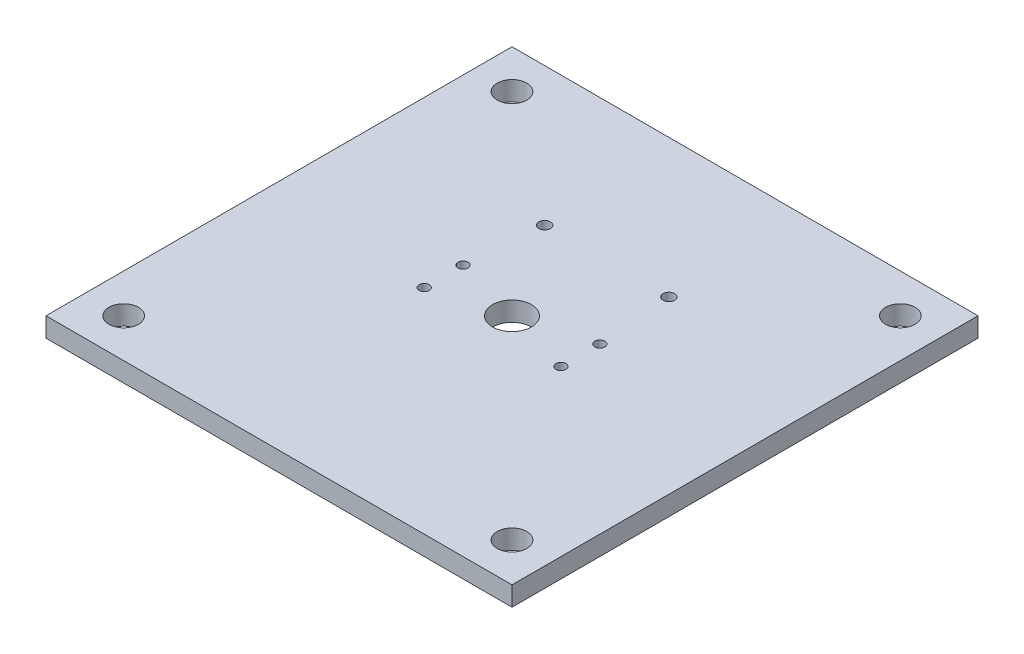
ISO-10303-21;
HEADER;
FILE_DESCRIPTION(('STEP AP214'),'2;1');
FILE_NAME('part.step','',(''),(''),'','','');
FILE_SCHEMA(('AUTOMOTIVE_DESIGN { 1 0 10303 214 1 1 1 1 }'));
ENDSEC;
DATA;
#1=APPLICATION_CONTEXT('core data for automotive mechanical design processes');
#2=APPLICATION_PROTOCOL_DEFINITION('international standard','automotive_design',2000,#1);
#3=PRODUCT_CONTEXT('',#1,'mechanical');
#4=PRODUCT('Part','Part','',(#3));
#5=PRODUCT_RELATED_PRODUCT_CATEGORY('part','',(#4));
#6=PRODUCT_DEFINITION_FORMATION('','',#4);
#7=PRODUCT_DEFINITION_CONTEXT('part definition',#1,'design');
#8=PRODUCT_DEFINITION('design','',#6,#7);
#9=PRODUCT_DEFINITION_SHAPE('','',#8);
#10=(LENGTH_UNIT() NAMED_UNIT(*) SI_UNIT(.MILLI.,.METRE.));
#11=(NAMED_UNIT(*) PLANE_ANGLE_UNIT() SI_UNIT($,.RADIAN.));
#12=(NAMED_UNIT(*) SI_UNIT($,.STERADIAN.) SOLID_ANGLE_UNIT());
#13=UNCERTAINTY_MEASURE_WITH_UNIT(LENGTH_MEASURE(1.E-05),#10,'distance_accuracy_value','');
#14=(GEOMETRIC_REPRESENTATION_CONTEXT(3) GLOBAL_UNCERTAINTY_ASSIGNED_CONTEXT((#13)) GLOBAL_UNIT_ASSIGNED_CONTEXT((#10,
#11,#12)) REPRESENTATION_CONTEXT('',''));
#15=CARTESIAN_POINT('',(0.,0.,0.));
#16=DIRECTION('',(0.,0.,1.));
#17=DIRECTION('',(1.,0.,0.));
#18=AXIS2_PLACEMENT_3D('',#15,#16,#17);
#19=CARTESIAN_POINT('',(0.,0.,0.));
#20=DIRECTION('',(0.,1.,0.));
#21=DIRECTION('',(0.,0.,1.));
#22=AXIS2_PLACEMENT_3D('',#19,#20,#21);
#23=PLANE('',#22);
#24=CARTESIAN_POINT('',(-22.352,0.,-6.35));
#25=DIRECTION('',(0.,1.,0.));
#26=DIRECTION('',(0.,0.,1.));
#27=AXIS2_PLACEMENT_3D('',#24,#25,#26);
#28=CIRCLE('',#27,1.64973);
#29=CARTESIAN_POINT('',(-22.352,0.,-4.70027));
#30=VERTEX_POINT('',#29);
#31=EDGE_CURVE('E110',#30,#30,#28,.T.);
#32=ORIENTED_EDGE('',*,*,#31,.T.);
#33=EDGE_LOOP('',(#32));
#34=FACE_BOUND('',#33,.T.);
#35=CARTESIAN_POINT('',(-22.352,0.,6.35));
#36=DIRECTION('',(0.,1.,0.));
#37=DIRECTION('',(0.,0.,1.));
#38=AXIS2_PLACEMENT_3D('',#35,#36,#37);
#39=CIRCLE('',#38,1.64973);
#40=CARTESIAN_POINT('',(-22.352,0.,7.99973));
#41=VERTEX_POINT('',#40);
#42=EDGE_CURVE('E114',#41,#41,#39,.T.);
#43=ORIENTED_EDGE('',*,*,#42,.T.);
#44=EDGE_LOOP('',(#43));
#45=FACE_BOUND('',#44,.T.);
#46=CARTESIAN_POINT('',(22.352,0.,-6.35));
#47=DIRECTION('',(0.,-1.,0.));
#48=DIRECTION('',(0.,0.,-1.));
#49=AXIS2_PLACEMENT_3D('',#46,#47,#48);
#50=CIRCLE('',#49,1.64973);
#51=CARTESIAN_POINT('',(22.352,0.,-7.99973));
#52=VERTEX_POINT('',#51);
#53=EDGE_CURVE('E117',#52,#52,#50,.F.);
#54=ORIENTED_EDGE('',*,*,#53,.T.);
#55=EDGE_LOOP('',(#54));
#56=FACE_BOUND('',#55,.T.);
#57=CARTESIAN_POINT('',(22.352,0.,6.35));
#58=DIRECTION('',(0.,-1.,0.));
#59=DIRECTION('',(0.,0.,-1.));
#60=AXIS2_PLACEMENT_3D('',#57,#58,#59);
#61=CIRCLE('',#60,1.64973);
#62=CARTESIAN_POINT('',(22.352,0.,4.70027));
#63=VERTEX_POINT('',#62);
#64=EDGE_CURVE('E120',#63,#63,#61,.F.);
#65=ORIENTED_EDGE('',*,*,#64,.T.);
#66=EDGE_LOOP('',(#65));
#67=FACE_BOUND('',#66,.T.);
#68=CARTESIAN_POINT('',(20.32,0.,-30.988));
#69=DIRECTION('',(0.,1.,0.));
#70=DIRECTION('',(0.,0.,1.));
#71=AXIS2_PLACEMENT_3D('',#68,#69,#70);
#72=CIRCLE('',#71,1.89865);
#73=CARTESIAN_POINT('',(20.32,0.,-29.08935));
#74=VERTEX_POINT('',#73);
#75=EDGE_CURVE('E123',#74,#74,#72,.T.);
#76=ORIENTED_EDGE('',*,*,#75,.T.);
#77=EDGE_LOOP('',(#76));
#78=FACE_BOUND('',#77,.T.);
#79=CARTESIAN_POINT('',(-20.32,0.,-30.988));
#80=DIRECTION('',(0.,-1.,0.));
#81=DIRECTION('',(0.,0.,-1.));
#82=AXIS2_PLACEMENT_3D('',#79,#80,#81);
#83=CIRCLE('',#82,1.89865);
#84=CARTESIAN_POINT('',(-20.32,0.,-32.88665));
#85=VERTEX_POINT('',#84);
#86=EDGE_CURVE('E126',#85,#85,#83,.F.);
#87=ORIENTED_EDGE('',*,*,#86,.T.);
#88=EDGE_LOOP('',(#87));
#89=FACE_BOUND('',#88,.T.);
#90=CARTESIAN_POINT('',(0.,0.,0.));
#91=DIRECTION('',(0.,-1.,0.));
#92=DIRECTION('',(0.,0.,-1.));
#93=AXIS2_PLACEMENT_3D('',#90,#91,#92);
#94=CIRCLE('',#93,6.35);
#95=CARTESIAN_POINT('',(0.,0.,-6.35));
#96=VERTEX_POINT('',#95);
#97=EDGE_CURVE('E129',#96,#96,#94,.F.);
#98=ORIENTED_EDGE('',*,*,#97,.T.);
#99=EDGE_LOOP('',(#98));
#100=FACE_BOUND('',#99,.T.);
#101=CARTESIAN_POINT('',(-63.5,0.,-63.5));
#102=DIRECTION('',(0.,-1.,0.));
#103=DIRECTION('',(0.,0.,-1.));
#104=AXIS2_PLACEMENT_3D('',#101,#102,#103);
#105=CIRCLE('',#104,4.826);
#106=CARTESIAN_POINT('',(-63.5,0.,-68.326));
#107=VERTEX_POINT('',#106);
#108=EDGE_CURVE('E132',#107,#107,#105,.F.);
#109=ORIENTED_EDGE('',*,*,#108,.T.);
#110=EDGE_LOOP('',(#109));
#111=FACE_BOUND('',#110,.T.);
#112=CARTESIAN_POINT('',(63.5,0.,-63.5));
#113=DIRECTION('',(0.,-1.,0.));
#114=DIRECTION('',(0.,0.,-1.));
#115=AXIS2_PLACEMENT_3D('',#112,#113,#114);
#116=CIRCLE('',#115,4.826);
#117=CARTESIAN_POINT('',(63.5,0.,-68.326));
#118=VERTEX_POINT('',#117);
#119=EDGE_CURVE('E135',#118,#118,#116,.F.);
#120=ORIENTED_EDGE('',*,*,#119,.T.);
#121=EDGE_LOOP('',(#120));
#122=FACE_BOUND('',#121,.T.);
#123=CARTESIAN_POINT('',(63.5,0.,63.5));
#124=DIRECTION('',(0.,-1.,0.));
#125=DIRECTION('',(0.,0.,-1.));
#126=AXIS2_PLACEMENT_3D('',#123,#124,#125);
#127=CIRCLE('',#126,4.826);
#128=CARTESIAN_POINT('',(63.5,0.,58.674));
#129=VERTEX_POINT('',#128);
#130=EDGE_CURVE('E137',#129,#129,#127,.F.);
#131=ORIENTED_EDGE('',*,*,#130,.T.);
#132=EDGE_LOOP('',(#131));
#133=FACE_BOUND('',#132,.T.);
#134=CARTESIAN_POINT('',(-63.5,0.,63.5));
#135=DIRECTION('',(0.,-1.,0.));
#136=DIRECTION('',(0.,0.,-1.));
#137=AXIS2_PLACEMENT_3D('',#134,#135,#136);
#138=CIRCLE('',#137,4.826);
#139=CARTESIAN_POINT('',(-63.5,0.,58.674));
#140=VERTEX_POINT('',#139);
#141=EDGE_CURVE('E19',#140,#140,#138,.F.);
#142=ORIENTED_EDGE('',*,*,#141,.T.);
#143=EDGE_LOOP('',(#142));
#144=FACE_BOUND('',#143,.T.);
#145=DIRECTION('',(0.,0.,-1.));
#146=VECTOR('',#145,1.);
#147=CARTESIAN_POINT('',(76.2,0.,76.2));
#148=LINE('',#147,#146);
#149=CARTESIAN_POINT('',(76.2,0.,76.2));
#150=VERTEX_POINT('',#149);
#151=CARTESIAN_POINT('',(76.2,0.,-76.2));
#152=VERTEX_POINT('',#151);
#153=EDGE_CURVE('E54',#150,#152,#148,.T.);
#154=ORIENTED_EDGE('',*,*,#153,.F.);
#155=DIRECTION('',(1.,0.,0.));
#156=VECTOR('',#155,1.);
#157=CARTESIAN_POINT('',(-76.2,0.,76.2));
#158=LINE('',#157,#156);
#159=CARTESIAN_POINT('',(-76.2,0.,76.2));
#160=VERTEX_POINT('',#159);
#161=EDGE_CURVE('E59',#160,#150,#158,.T.);
#162=ORIENTED_EDGE('',*,*,#161,.F.);
#163=DIRECTION('',(0.,0.,1.));
#164=VECTOR('',#163,1.);
#165=CARTESIAN_POINT('',(-76.2,0.,-76.2));
#166=LINE('',#165,#164);
#167=CARTESIAN_POINT('',(-76.2,0.,-76.2));
#168=VERTEX_POINT('',#167);
#169=EDGE_CURVE('E142',#168,#160,#166,.T.);
#170=ORIENTED_EDGE('',*,*,#169,.F.);
#171=DIRECTION('',(-1.,0.,0.));
#172=VECTOR('',#171,1.);
#173=CARTESIAN_POINT('',(76.2,0.,-76.2));
#174=LINE('',#173,#172);
#175=EDGE_CURVE('E69',#152,#168,#174,.T.);
#176=ORIENTED_EDGE('',*,*,#175,.F.);
#177=EDGE_LOOP('',(#154,#162,#170,#176));
#178=FACE_BOUND('',#177,.T.);
#179=ADVANCED_FACE('F16',(#34,#45,#56,#67,#78,#89,#100,#111,#122,#133,#144,#178),#23,.F.);
#180=CARTESIAN_POINT('',(-76.2,0.,76.2));
#181=DIRECTION('',(0.,0.,1.));
#182=DIRECTION('',(1.,0.,0.));
#183=AXIS2_PLACEMENT_3D('',#180,#181,#182);
#184=PLANE('',#183);
#185=DIRECTION('',(0.,1.,0.));
#186=VECTOR('',#185,1.);
#187=CARTESIAN_POINT('',(-76.2,0.,76.2));
#188=LINE('',#187,#186);
#189=CARTESIAN_POINT('',(-76.2,6.35,76.2));
#190=VERTEX_POINT('',#189);
#191=EDGE_CURVE('E64',#160,#190,#188,.T.);
#192=ORIENTED_EDGE('',*,*,#191,.F.);
#193=ORIENTED_EDGE('',*,*,#161,.T.);
#194=DIRECTION('',(0.,1.,0.));
#195=VECTOR('',#194,1.);
#196=CARTESIAN_POINT('',(76.2,0.,76.2));
#197=LINE('',#196,#195);
#198=CARTESIAN_POINT('',(76.2,6.35,76.2));
#199=VERTEX_POINT('',#198);
#200=EDGE_CURVE('E61',#199,#150,#197,.F.);
#201=ORIENTED_EDGE('',*,*,#200,.F.);
#202=DIRECTION('',(1.,0.,0.));
#203=VECTOR('',#202,1.);
#204=CARTESIAN_POINT('',(0.,6.35,76.2));
#205=LINE('',#204,#203);
#206=EDGE_CURVE('E113',#190,#199,#205,.T.);
#207=ORIENTED_EDGE('',*,*,#206,.F.);
#208=EDGE_LOOP('',(#192,#193,#201,#207));
#209=FACE_BOUND('',#208,.T.);
#210=ADVANCED_FACE('F60',(#209),#184,.T.);
#211=CARTESIAN_POINT('',(76.2,0.,76.2));
#212=DIRECTION('',(1.,0.,0.));
#213=DIRECTION('',(0.,0.,-1.));
#214=AXIS2_PLACEMENT_3D('',#211,#212,#213);
#215=PLANE('',#214);
#216=ORIENTED_EDGE('',*,*,#200,.T.);
#217=ORIENTED_EDGE('',*,*,#153,.T.);
#218=DIRECTION('',(0.,1.,0.));
#219=VECTOR('',#218,1.);
#220=CARTESIAN_POINT('',(76.2,0.,-76.2));
#221=LINE('',#220,#219);
#222=CARTESIAN_POINT('',(76.2,6.35,-76.2));
#223=VERTEX_POINT('',#222);
#224=EDGE_CURVE('E71',#223,#152,#221,.F.);
#225=ORIENTED_EDGE('',*,*,#224,.F.);
#226=DIRECTION('',(0.,0.,1.));
#227=VECTOR('',#226,1.);
#228=CARTESIAN_POINT('',(76.2,6.35,0.));
#229=LINE('',#228,#227);
#230=EDGE_CURVE('E75',#199,#223,#229,.F.);
#231=ORIENTED_EDGE('',*,*,#230,.F.);
#232=EDGE_LOOP('',(#216,#217,#225,#231));
#233=FACE_BOUND('',#232,.T.);
#234=ADVANCED_FACE('F73',(#233),#215,.T.);
#235=CARTESIAN_POINT('',(76.2,0.,-76.2));
#236=DIRECTION('',(0.,0.,-1.));
#237=DIRECTION('',(-1.,0.,0.));
#238=AXIS2_PLACEMENT_3D('',#235,#236,#237);
#239=PLANE('',#238);
#240=ORIENTED_EDGE('',*,*,#224,.T.);
#241=ORIENTED_EDGE('',*,*,#175,.T.);
#242=DIRECTION('',(0.,1.,0.));
#243=VECTOR('',#242,1.);
#244=CARTESIAN_POINT('',(-76.2,0.,-76.2));
#245=LINE('',#244,#243);
#246=CARTESIAN_POINT('',(-76.2,6.35,-76.2));
#247=VERTEX_POINT('',#246);
#248=EDGE_CURVE('E34',#247,#168,#245,.F.);
#249=ORIENTED_EDGE('',*,*,#248,.F.);
#250=DIRECTION('',(1.,0.,0.));
#251=VECTOR('',#250,1.);
#252=CARTESIAN_POINT('',(0.,6.35,-76.2));
#253=LINE('',#252,#251);
#254=EDGE_CURVE('E154',#223,#247,#253,.F.);
#255=ORIENTED_EDGE('',*,*,#254,.F.);
#256=EDGE_LOOP('',(#240,#241,#249,#255));
#257=FACE_BOUND('',#256,.T.);
#258=ADVANCED_FACE('F152',(#257),#239,.T.);
#259=CARTESIAN_POINT('',(-76.2,0.,-76.2));
#260=DIRECTION('',(-1.,0.,0.));
#261=DIRECTION('',(0.,0.,1.));
#262=AXIS2_PLACEMENT_3D('',#259,#260,#261);
#263=PLANE('',#262);
#264=ORIENTED_EDGE('',*,*,#248,.T.);
#265=ORIENTED_EDGE('',*,*,#169,.T.);
#266=ORIENTED_EDGE('',*,*,#191,.T.);
#267=DIRECTION('',(0.,0.,1.));
#268=VECTOR('',#267,1.);
#269=CARTESIAN_POINT('',(-76.2,6.35,0.));
#270=LINE('',#269,#268);
#271=EDGE_CURVE('E109',#247,#190,#270,.T.);
#272=ORIENTED_EDGE('',*,*,#271,.F.);
#273=EDGE_LOOP('',(#264,#265,#266,#272));
#274=FACE_BOUND('',#273,.T.);
#275=ADVANCED_FACE('F160',(#274),#263,.T.);
#276=CARTESIAN_POINT('',(-63.5,0.,63.5));
#277=DIRECTION('',(0.,-1.,0.));
#278=DIRECTION('',(0.,0.,-1.));
#279=AXIS2_PLACEMENT_3D('',#276,#277,#278);
#280=CYLINDRICAL_SURFACE('',#279,4.826);
#281=CARTESIAN_POINT('',(-63.5,6.35,63.5));
#282=DIRECTION('',(0.,-1.,0.));
#283=DIRECTION('',(0.,0.,-1.));
#284=AXIS2_PLACEMENT_3D('',#281,#282,#283);
#285=CIRCLE('',#284,4.826);
#286=CARTESIAN_POINT('',(-63.5,6.35,58.674));
#287=VERTEX_POINT('',#286);
#288=EDGE_CURVE('E106',#287,#287,#285,.T.);
#289=ORIENTED_EDGE('',*,*,#288,.F.);
#290=EDGE_LOOP('',(#289));
#291=FACE_BOUND('',#290,.T.);
#292=ORIENTED_EDGE('',*,*,#141,.F.);
#293=EDGE_LOOP('',(#292));
#294=FACE_BOUND('',#293,.T.);
#295=ADVANCED_FACE('F162',(#291,#294),#280,.F.);
#296=CARTESIAN_POINT('',(63.5,0.,63.5));
#297=DIRECTION('',(0.,-1.,0.));
#298=DIRECTION('',(0.,0.,-1.));
#299=AXIS2_PLACEMENT_3D('',#296,#297,#298);
#300=CYLINDRICAL_SURFACE('',#299,4.826);
#301=CARTESIAN_POINT('',(63.5,6.35,63.5));
#302=DIRECTION('',(0.,-1.,0.));
#303=DIRECTION('',(0.,0.,-1.));
#304=AXIS2_PLACEMENT_3D('',#301,#302,#303);
#305=CIRCLE('',#304,4.826);
#306=CARTESIAN_POINT('',(63.5,6.35,58.674));
#307=VERTEX_POINT('',#306);
#308=EDGE_CURVE('E103',#307,#307,#305,.T.);
#309=ORIENTED_EDGE('',*,*,#308,.F.);
#310=EDGE_LOOP('',(#309));
#311=FACE_BOUND('',#310,.T.);
#312=ORIENTED_EDGE('',*,*,#130,.F.);
#313=EDGE_LOOP('',(#312));
#314=FACE_BOUND('',#313,.T.);
#315=ADVANCED_FACE('F169',(#311,#314),#300,.F.);
#316=CARTESIAN_POINT('',(63.5,0.,-63.5));
#317=DIRECTION('',(0.,-1.,0.));
#318=DIRECTION('',(0.,0.,-1.));
#319=AXIS2_PLACEMENT_3D('',#316,#317,#318);
#320=CYLINDRICAL_SURFACE('',#319,4.826);
#321=CARTESIAN_POINT('',(63.5,6.35,-63.5));
#322=DIRECTION('',(0.,-1.,0.));
#323=DIRECTION('',(0.,0.,-1.));
#324=AXIS2_PLACEMENT_3D('',#321,#322,#323);
#325=CIRCLE('',#324,4.826);
#326=CARTESIAN_POINT('',(63.5,6.35,-68.326));
#327=VERTEX_POINT('',#326);
#328=EDGE_CURVE('E100',#327,#327,#325,.T.);
#329=ORIENTED_EDGE('',*,*,#328,.F.);
#330=EDGE_LOOP('',(#329));
#331=FACE_BOUND('',#330,.T.);
#332=ORIENTED_EDGE('',*,*,#119,.F.);
#333=EDGE_LOOP('',(#332));
#334=FACE_BOUND('',#333,.T.);
#335=ADVANCED_FACE('F211',(#331,#334),#320,.F.);
#336=CARTESIAN_POINT('',(-63.5,0.,-63.5));
#337=DIRECTION('',(0.,-1.,0.));
#338=DIRECTION('',(0.,0.,-1.));
#339=AXIS2_PLACEMENT_3D('',#336,#337,#338);
#340=CYLINDRICAL_SURFACE('',#339,4.826);
#341=CARTESIAN_POINT('',(-63.5,6.35,-63.5));
#342=DIRECTION('',(0.,-1.,0.));
#343=DIRECTION('',(0.,0.,-1.));
#344=AXIS2_PLACEMENT_3D('',#341,#342,#343);
#345=CIRCLE('',#344,4.826);
#346=CARTESIAN_POINT('',(-63.5,6.35,-68.326));
#347=VERTEX_POINT('',#346);
#348=EDGE_CURVE('E97',#347,#347,#345,.T.);
#349=ORIENTED_EDGE('',*,*,#348,.F.);
#350=EDGE_LOOP('',(#349));
#351=FACE_BOUND('',#350,.T.);
#352=ORIENTED_EDGE('',*,*,#108,.F.);
#353=EDGE_LOOP('',(#352));
#354=FACE_BOUND('',#353,.T.);
#355=ADVANCED_FACE('F207',(#351,#354),#340,.F.);
#356=CARTESIAN_POINT('',(0.,0.,0.));
#357=DIRECTION('',(0.,-1.,0.));
#358=DIRECTION('',(0.,0.,-1.));
#359=AXIS2_PLACEMENT_3D('',#356,#357,#358);
#360=CYLINDRICAL_SURFACE('',#359,6.35);
#361=CARTESIAN_POINT('',(0.,6.35,0.));
#362=DIRECTION('',(0.,-1.,0.));
#363=DIRECTION('',(0.,0.,-1.));
#364=AXIS2_PLACEMENT_3D('',#361,#362,#363);
#365=CIRCLE('',#364,6.35);
#366=CARTESIAN_POINT('',(0.,6.35,-6.35));
#367=VERTEX_POINT('',#366);
#368=EDGE_CURVE('E94',#367,#367,#365,.T.);
#369=ORIENTED_EDGE('',*,*,#368,.F.);
#370=EDGE_LOOP('',(#369));
#371=FACE_BOUND('',#370,.T.);
#372=ORIENTED_EDGE('',*,*,#97,.F.);
#373=EDGE_LOOP('',(#372));
#374=FACE_BOUND('',#373,.T.);
#375=ADVANCED_FACE('F203',(#371,#374),#360,.F.);
#376=CARTESIAN_POINT('',(-20.32,13.1993652150325,-30.988));
#377=DIRECTION('',(0.,-1.,0.));
#378=DIRECTION('',(0.,0.,-1.));
#379=AXIS2_PLACEMENT_3D('',#376,#377,#378);
#380=CYLINDRICAL_SURFACE('',#379,1.89865);
#381=CARTESIAN_POINT('',(-20.32,6.35,-30.988));
#382=DIRECTION('',(0.,-1.,0.));
#383=DIRECTION('',(0.,0.,-1.));
#384=AXIS2_PLACEMENT_3D('',#381,#382,#383);
#385=CIRCLE('',#384,1.89865);
#386=CARTESIAN_POINT('',(-20.32,6.35,-32.88665));
#387=VERTEX_POINT('',#386);
#388=EDGE_CURVE('E91',#387,#387,#385,.T.);
#389=ORIENTED_EDGE('',*,*,#388,.F.);
#390=EDGE_LOOP('',(#389));
#391=FACE_BOUND('',#390,.T.);
#392=ORIENTED_EDGE('',*,*,#86,.F.);
#393=EDGE_LOOP('',(#392));
#394=FACE_BOUND('',#393,.T.);
#395=ADVANCED_FACE('F199',(#391,#394),#380,.F.);
#396=CARTESIAN_POINT('',(20.32,13.1993652150325,-30.988));
#397=DIRECTION('',(0.,1.,0.));
#398=DIRECTION('',(0.,0.,1.));
#399=AXIS2_PLACEMENT_3D('',#396,#397,#398);
#400=CYLINDRICAL_SURFACE('',#399,1.89865);
#401=ORIENTED_EDGE('',*,*,#75,.F.);
#402=EDGE_LOOP('',(#401));
#403=FACE_BOUND('',#402,.T.);
#404=CARTESIAN_POINT('',(20.32,6.35,-30.988));
#405=DIRECTION('',(0.,1.,0.));
#406=DIRECTION('',(0.,0.,1.));
#407=AXIS2_PLACEMENT_3D('',#404,#405,#406);
#408=CIRCLE('',#407,1.89865);
#409=CARTESIAN_POINT('',(20.32,6.35,-29.08935));
#410=VERTEX_POINT('',#409);
#411=EDGE_CURVE('E88',#410,#410,#408,.F.);
#412=ORIENTED_EDGE('',*,*,#411,.F.);
#413=EDGE_LOOP('',(#412));
#414=FACE_BOUND('',#413,.T.);
#415=ADVANCED_FACE('F195',(#403,#414),#400,.F.);
#416=CARTESIAN_POINT('',(22.352,11.4421206784798,6.35));
#417=DIRECTION('',(0.,-1.,0.));
#418=DIRECTION('',(0.,0.,-1.));
#419=AXIS2_PLACEMENT_3D('',#416,#417,#418);
#420=CYLINDRICAL_SURFACE('',#419,1.64973);
#421=CARTESIAN_POINT('',(22.352,6.35,6.35));
#422=DIRECTION('',(0.,-1.,0.));
#423=DIRECTION('',(0.,0.,-1.));
#424=AXIS2_PLACEMENT_3D('',#421,#422,#423);
#425=CIRCLE('',#424,1.64973);
#426=CARTESIAN_POINT('',(22.352,6.35,4.70027));
#427=VERTEX_POINT('',#426);
#428=EDGE_CURVE('E85',#427,#427,#425,.T.);
#429=ORIENTED_EDGE('',*,*,#428,.F.);
#430=EDGE_LOOP('',(#429));
#431=FACE_BOUND('',#430,.T.);
#432=ORIENTED_EDGE('',*,*,#64,.F.);
#433=EDGE_LOOP('',(#432));
#434=FACE_BOUND('',#433,.T.);
#435=ADVANCED_FACE('F191',(#431,#434),#420,.F.);
#436=CARTESIAN_POINT('',(22.352,11.4421206784798,-6.35));
#437=DIRECTION('',(0.,-1.,0.));
#438=DIRECTION('',(0.,0.,-1.));
#439=AXIS2_PLACEMENT_3D('',#436,#437,#438);
#440=CYLINDRICAL_SURFACE('',#439,1.64973);
#441=CARTESIAN_POINT('',(22.352,6.35,-6.35));
#442=DIRECTION('',(0.,-1.,0.));
#443=DIRECTION('',(0.,0.,-1.));
#444=AXIS2_PLACEMENT_3D('',#441,#442,#443);
#445=CIRCLE('',#444,1.64973);
#446=CARTESIAN_POINT('',(22.352,6.35,-7.99973));
#447=VERTEX_POINT('',#446);
#448=EDGE_CURVE('E82',#447,#447,#445,.T.);
#449=ORIENTED_EDGE('',*,*,#448,.F.);
#450=EDGE_LOOP('',(#449));
#451=FACE_BOUND('',#450,.T.);
#452=ORIENTED_EDGE('',*,*,#53,.F.);
#453=EDGE_LOOP('',(#452));
#454=FACE_BOUND('',#453,.T.);
#455=ADVANCED_FACE('F187',(#451,#454),#440,.F.);
#456=CARTESIAN_POINT('',(-22.352,11.4421206784798,6.35));
#457=DIRECTION('',(0.,1.,0.));
#458=DIRECTION('',(0.,0.,1.));
#459=AXIS2_PLACEMENT_3D('',#456,#457,#458);
#460=CYLINDRICAL_SURFACE('',#459,1.64973);
#461=ORIENTED_EDGE('',*,*,#42,.F.);
#462=EDGE_LOOP('',(#461));
#463=FACE_BOUND('',#462,.T.);
#464=CARTESIAN_POINT('',(-22.352,6.35,6.35));
#465=DIRECTION('',(0.,1.,0.));
#466=DIRECTION('',(0.,0.,1.));
#467=AXIS2_PLACEMENT_3D('',#464,#465,#466);
#468=CIRCLE('',#467,1.64973);
#469=CARTESIAN_POINT('',(-22.352,6.35,7.99973));
#470=VERTEX_POINT('',#469);
#471=EDGE_CURVE('E25',#470,#470,#468,.F.);
#472=ORIENTED_EDGE('',*,*,#471,.F.);
#473=EDGE_LOOP('',(#472));
#474=FACE_BOUND('',#473,.T.);
#475=ADVANCED_FACE('F180',(#463,#474),#460,.F.);
#476=CARTESIAN_POINT('',(-22.352,11.4421206784798,-6.35));
#477=DIRECTION('',(0.,1.,0.));
#478=DIRECTION('',(0.,0.,1.));
#479=AXIS2_PLACEMENT_3D('',#476,#477,#478);
#480=CYLINDRICAL_SURFACE('',#479,1.64973);
#481=ORIENTED_EDGE('',*,*,#31,.F.);
#482=EDGE_LOOP('',(#481));
#483=FACE_BOUND('',#482,.T.);
#484=CARTESIAN_POINT('',(-22.352,6.35,-6.35));
#485=DIRECTION('',(0.,1.,0.));
#486=DIRECTION('',(0.,0.,1.));
#487=AXIS2_PLACEMENT_3D('',#484,#485,#486);
#488=CIRCLE('',#487,1.64973);
#489=CARTESIAN_POINT('',(-22.352,6.35,-4.70027));
#490=VERTEX_POINT('',#489);
#491=EDGE_CURVE('E11',#490,#490,#488,.F.);
#492=ORIENTED_EDGE('',*,*,#491,.F.);
#493=EDGE_LOOP('',(#492));
#494=FACE_BOUND('',#493,.T.);
#495=ADVANCED_FACE('F174',(#483,#494),#480,.F.);
#496=CARTESIAN_POINT('',(0.,6.35,0.));
#497=DIRECTION('',(0.,1.,0.));
#498=DIRECTION('',(0.,0.,1.));
#499=AXIS2_PLACEMENT_3D('',#496,#497,#498);
#500=PLANE('',#499);
#501=ORIENTED_EDGE('',*,*,#491,.T.);
#502=EDGE_LOOP('',(#501));
#503=FACE_BOUND('',#502,.T.);
#504=ORIENTED_EDGE('',*,*,#471,.T.);
#505=EDGE_LOOP('',(#504));
#506=FACE_BOUND('',#505,.T.);
#507=ORIENTED_EDGE('',*,*,#448,.T.);
#508=EDGE_LOOP('',(#507));
#509=FACE_BOUND('',#508,.T.);
#510=ORIENTED_EDGE('',*,*,#428,.T.);
#511=EDGE_LOOP('',(#510));
#512=FACE_BOUND('',#511,.T.);
#513=ORIENTED_EDGE('',*,*,#411,.T.);
#514=EDGE_LOOP('',(#513));
#515=FACE_BOUND('',#514,.T.);
#516=ORIENTED_EDGE('',*,*,#388,.T.);
#517=EDGE_LOOP('',(#516));
#518=FACE_BOUND('',#517,.T.);
#519=ORIENTED_EDGE('',*,*,#368,.T.);
#520=EDGE_LOOP('',(#519));
#521=FACE_BOUND('',#520,.T.);
#522=ORIENTED_EDGE('',*,*,#348,.T.);
#523=EDGE_LOOP('',(#522));
#524=FACE_BOUND('',#523,.T.);
#525=ORIENTED_EDGE('',*,*,#328,.T.);
#526=EDGE_LOOP('',(#525));
#527=FACE_BOUND('',#526,.T.);
#528=ORIENTED_EDGE('',*,*,#308,.T.);
#529=EDGE_LOOP('',(#528));
#530=FACE_BOUND('',#529,.T.);
#531=ORIENTED_EDGE('',*,*,#288,.T.);
#532=EDGE_LOOP('',(#531));
#533=FACE_BOUND('',#532,.T.);
#534=ORIENTED_EDGE('',*,*,#254,.T.);
#535=ORIENTED_EDGE('',*,*,#271,.T.);
#536=ORIENTED_EDGE('',*,*,#206,.T.);
#537=ORIENTED_EDGE('',*,*,#230,.T.);
#538=EDGE_LOOP('',(#534,#535,#536,#537));
#539=FACE_BOUND('',#538,.T.);
#540=ADVANCED_FACE('F158',(#503,#506,#509,#512,#515,#518,#521,#524,#527,#530,#533,#539),#500,.T.);
#541=CLOSED_SHELL('',(#179,#210,#234,#258,#275,#295,#315,#335,#355,#375,#395,#415,#435,#455,
#475,#495,#540));
#542=MANIFOLD_SOLID_BREP('B1',#541);
#543=ADVANCED_BREP_SHAPE_REPRESENTATION('',(#18,#542),#14);
#544=SHAPE_DEFINITION_REPRESENTATION(#9,#543);
ENDSEC;
END-ISO-10303-21;
